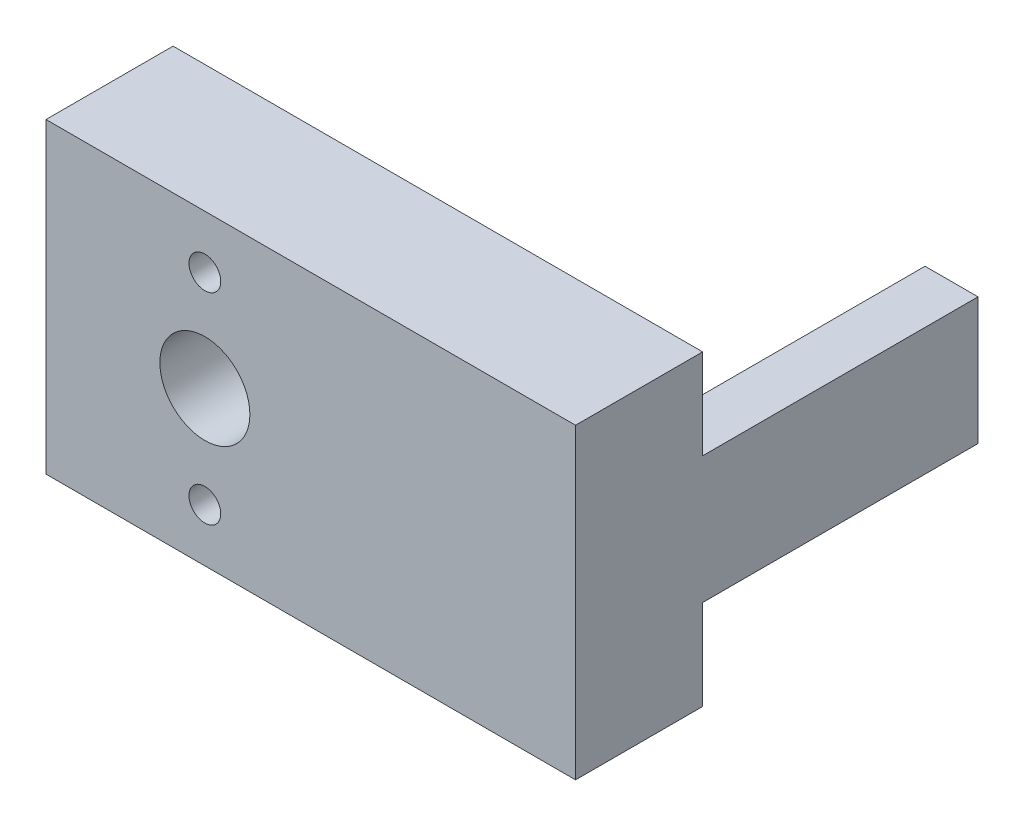
ISO-10303-21;
HEADER;
FILE_DESCRIPTION(('STEP AP214'),'2;1');
FILE_NAME('part.step','',(''),(''),'','','');
FILE_SCHEMA(('AUTOMOTIVE_DESIGN { 1 0 10303 214 1 1 1 1 }'));
ENDSEC;
DATA;
#1=APPLICATION_CONTEXT('core data for automotive mechanical design processes');
#2=APPLICATION_PROTOCOL_DEFINITION('international standard','automotive_design',2000,#1);
#3=PRODUCT_CONTEXT('',#1,'mechanical');
#4=PRODUCT('Part','Part','',(#3));
#5=PRODUCT_RELATED_PRODUCT_CATEGORY('part','',(#4));
#6=PRODUCT_DEFINITION_FORMATION('','',#4);
#7=PRODUCT_DEFINITION_CONTEXT('part definition',#1,'design');
#8=PRODUCT_DEFINITION('design','',#6,#7);
#9=PRODUCT_DEFINITION_SHAPE('','',#8);
#10=(LENGTH_UNIT() NAMED_UNIT(*) SI_UNIT(.MILLI.,.METRE.));
#11=(NAMED_UNIT(*) PLANE_ANGLE_UNIT() SI_UNIT($,.RADIAN.));
#12=(NAMED_UNIT(*) SI_UNIT($,.STERADIAN.) SOLID_ANGLE_UNIT());
#13=UNCERTAINTY_MEASURE_WITH_UNIT(LENGTH_MEASURE(1.E-05),#10,'distance_accuracy_value','');
#14=(GEOMETRIC_REPRESENTATION_CONTEXT(3) GLOBAL_UNCERTAINTY_ASSIGNED_CONTEXT((#13)) GLOBAL_UNIT_ASSIGNED_CONTEXT((#10,
#11,#12)) REPRESENTATION_CONTEXT('',''));
#15=CARTESIAN_POINT('',(0.,0.,0.));
#16=DIRECTION('',(0.,0.,1.));
#17=DIRECTION('',(1.,0.,0.));
#18=AXIS2_PLACEMENT_3D('',#15,#16,#17);
#19=CARTESIAN_POINT('',(0.,0.,0.));
#20=DIRECTION('',(0.,0.,1.));
#21=DIRECTION('',(1.,0.,0.));
#22=AXIS2_PLACEMENT_3D('',#19,#20,#21);
#23=PLANE('',#22);
#24=CARTESIAN_POINT('',(-12.5,0.,0.));
#25=DIRECTION('',(0.,0.,1.));
#26=DIRECTION('',(1.,0.,0.));
#27=AXIS2_PLACEMENT_3D('',#24,#25,#26);
#28=CIRCLE('',#27,4.25);
#29=CARTESIAN_POINT('',(-8.25,0.,0.));
#30=VERTEX_POINT('',#29);
#31=EDGE_CURVE('E154',#30,#30,#28,.T.);
#32=ORIENTED_EDGE('',*,*,#31,.T.);
#33=EDGE_LOOP('',(#32));
#34=FACE_BOUND('',#33,.T.);
#35=CARTESIAN_POINT('',(-12.5,-9.5,0.));
#36=DIRECTION('',(0.,0.,1.));
#37=DIRECTION('',(1.,0.,0.));
#38=AXIS2_PLACEMENT_3D('',#35,#36,#37);
#39=CIRCLE('',#38,1.5);
#40=CARTESIAN_POINT('',(-11.,-9.5,0.));
#41=VERTEX_POINT('',#40);
#42=EDGE_CURVE('E136',#41,#41,#39,.T.);
#43=ORIENTED_EDGE('',*,*,#42,.T.);
#44=EDGE_LOOP('',(#43));
#45=FACE_BOUND('',#44,.T.);
#46=CARTESIAN_POINT('',(-12.5,9.5,0.));
#47=DIRECTION('',(0.,0.,1.));
#48=DIRECTION('',(1.,0.,0.));
#49=AXIS2_PLACEMENT_3D('',#46,#47,#48);
#50=CIRCLE('',#49,1.5);
#51=CARTESIAN_POINT('',(-11.,9.5,0.));
#52=VERTEX_POINT('',#51);
#53=EDGE_CURVE('E142',#52,#52,#50,.T.);
#54=ORIENTED_EDGE('',*,*,#53,.T.);
#55=EDGE_LOOP('',(#54));
#56=FACE_BOUND('',#55,.T.);
#57=DIRECTION('',(1.,0.,0.));
#58=VECTOR('',#57,1.);
#59=CARTESIAN_POINT('',(22.5,6.,0.));
#60=LINE('',#59,#58);
#61=CARTESIAN_POINT('',(17.5,6.,0.));
#62=VERTEX_POINT('',#61);
#63=CARTESIAN_POINT('',(22.5,6.,0.));
#64=VERTEX_POINT('',#63);
#65=EDGE_CURVE('E55',#62,#64,#60,.T.);
#66=ORIENTED_EDGE('',*,*,#65,.F.);
#67=DIRECTION('',(0.,1.,0.));
#68=VECTOR('',#67,1.);
#69=CARTESIAN_POINT('',(17.5,6.,0.));
#70=LINE('',#69,#68);
#71=CARTESIAN_POINT('',(17.5,-6.,0.));
#72=VERTEX_POINT('',#71);
#73=EDGE_CURVE('E340',#72,#62,#70,.T.);
#74=ORIENTED_EDGE('',*,*,#73,.F.);
#75=DIRECTION('',(-1.,0.,0.));
#76=VECTOR('',#75,1.);
#77=CARTESIAN_POINT('',(17.5,-6.,0.));
#78=LINE('',#77,#76);
#79=CARTESIAN_POINT('',(22.5,-6.,0.));
#80=VERTEX_POINT('',#79);
#81=EDGE_CURVE('E350',#80,#72,#78,.T.);
#82=ORIENTED_EDGE('',*,*,#81,.F.);
#83=DIRECTION('',(0.,1.,0.));
#84=VECTOR('',#83,1.);
#85=CARTESIAN_POINT('',(22.5,14.5,0.));
#86=LINE('',#85,#84);
#87=CARTESIAN_POINT('',(22.5,-14.5,0.));
#88=VERTEX_POINT('',#87);
#89=EDGE_CURVE('E129',#88,#80,#86,.T.);
#90=ORIENTED_EDGE('',*,*,#89,.F.);
#91=DIRECTION('',(1.,0.,0.));
#92=VECTOR('',#91,1.);
#93=CARTESIAN_POINT('',(-27.5,-14.5,0.));
#94=LINE('',#93,#92);
#95=CARTESIAN_POINT('',(-27.5,-14.5,0.));
#96=VERTEX_POINT('',#95);
#97=EDGE_CURVE('E166',#96,#88,#94,.T.);
#98=ORIENTED_EDGE('',*,*,#97,.F.);
#99=DIRECTION('',(0.,-1.,0.));
#100=VECTOR('',#99,1.);
#101=CARTESIAN_POINT('',(-27.5,14.5,0.));
#102=LINE('',#101,#100);
#103=CARTESIAN_POINT('',(-27.5,14.5,0.));
#104=VERTEX_POINT('',#103);
#105=EDGE_CURVE('E181',#104,#96,#102,.T.);
#106=ORIENTED_EDGE('',*,*,#105,.F.);
#107=DIRECTION('',(-1.,0.,0.));
#108=VECTOR('',#107,1.);
#109=CARTESIAN_POINT('',(-27.5,14.5,0.));
#110=LINE('',#109,#108);
#111=CARTESIAN_POINT('',(22.5,14.5,0.));
#112=VERTEX_POINT('',#111);
#113=EDGE_CURVE('E178',#112,#104,#110,.T.);
#114=ORIENTED_EDGE('',*,*,#113,.F.);
#115=EDGE_CURVE('E60',#64,#112,#86,.T.);
#116=ORIENTED_EDGE('',*,*,#115,.F.);
#117=EDGE_LOOP('',(#66,#74,#82,#90,#98,#106,#114,#116));
#118=FACE_BOUND('',#117,.T.);
#119=ADVANCED_FACE('F39',(#34,#45,#56,#118),#23,.F.);
#120=CARTESIAN_POINT('',(22.5,14.5,12.));
#121=DIRECTION('',(-1.,0.,0.));
#122=DIRECTION('',(0.,-1.,0.));
#123=AXIS2_PLACEMENT_3D('',#120,#121,#122);
#124=PLANE('',#123);
#125=ORIENTED_EDGE('',*,*,#89,.T.);
#126=DIRECTION('',(0.,0.,1.));
#127=VECTOR('',#126,1.);
#128=CARTESIAN_POINT('',(22.5,-6.,-26.));
#129=LINE('',#128,#127);
#130=CARTESIAN_POINT('',(22.5,-6.,-26.));
#131=VERTEX_POINT('',#130);
#132=EDGE_CURVE('E108',#131,#80,#129,.T.);
#133=ORIENTED_EDGE('',*,*,#132,.F.);
#134=DIRECTION('',(0.,-1.,0.));
#135=VECTOR('',#134,1.);
#136=CARTESIAN_POINT('',(22.5,-6.,-26.));
#137=LINE('',#136,#135);
#138=CARTESIAN_POINT('',(22.5,6.,-26.));
#139=VERTEX_POINT('',#138);
#140=EDGE_CURVE('E115',#139,#131,#137,.T.);
#141=ORIENTED_EDGE('',*,*,#140,.F.);
#142=DIRECTION('',(0.,0.,1.));
#143=VECTOR('',#142,1.);
#144=CARTESIAN_POINT('',(22.5,6.,-26.));
#145=LINE('',#144,#143);
#146=EDGE_CURVE('E337',#139,#64,#145,.T.);
#147=ORIENTED_EDGE('',*,*,#146,.T.);
#148=ORIENTED_EDGE('',*,*,#115,.T.);
#149=DIRECTION('',(0.,0.,-1.));
#150=VECTOR('',#149,1.);
#151=CARTESIAN_POINT('',(22.5,14.5,12.));
#152=LINE('',#151,#150);
#153=CARTESIAN_POINT('',(22.5,14.5,12.));
#154=VERTEX_POINT('',#153);
#155=EDGE_CURVE('E11',#154,#112,#152,.T.);
#156=ORIENTED_EDGE('',*,*,#155,.F.);
#157=DIRECTION('',(0.,1.,0.));
#158=VECTOR('',#157,1.);
#159=CARTESIAN_POINT('',(22.5,14.5,12.));
#160=LINE('',#159,#158);
#161=CARTESIAN_POINT('',(22.5,-14.5,12.));
#162=VERTEX_POINT('',#161);
#163=EDGE_CURVE('E161',#162,#154,#160,.T.);
#164=ORIENTED_EDGE('',*,*,#163,.F.);
#165=DIRECTION('',(0.,0.,-1.));
#166=VECTOR('',#165,1.);
#167=CARTESIAN_POINT('',(22.5,-14.5,12.));
#168=LINE('',#167,#166);
#169=EDGE_CURVE('E175',#162,#88,#168,.T.);
#170=ORIENTED_EDGE('',*,*,#169,.T.);
#171=EDGE_LOOP('',(#125,#133,#141,#147,#148,#156,#164,#170));
#172=FACE_BOUND('',#171,.T.);
#173=ADVANCED_FACE('F41',(#172),#124,.F.);
#174=CARTESIAN_POINT('',(-27.5,14.5,12.));
#175=DIRECTION('',(0.,-1.,0.));
#176=DIRECTION('',(0.,0.,-1.));
#177=AXIS2_PLACEMENT_3D('',#174,#175,#176);
#178=PLANE('',#177);
#179=ORIENTED_EDGE('',*,*,#113,.T.);
#180=DIRECTION('',(0.,0.,-1.));
#181=VECTOR('',#180,1.);
#182=CARTESIAN_POINT('',(-27.5,14.5,12.));
#183=LINE('',#182,#181);
#184=CARTESIAN_POINT('',(-27.5,14.5,12.));
#185=VERTEX_POINT('',#184);
#186=EDGE_CURVE('E48',#185,#104,#183,.T.);
#187=ORIENTED_EDGE('',*,*,#186,.F.);
#188=DIRECTION('',(-1.,0.,0.));
#189=VECTOR('',#188,1.);
#190=CARTESIAN_POINT('',(-27.5,14.5,12.));
#191=LINE('',#190,#189);
#192=EDGE_CURVE('E165',#154,#185,#191,.T.);
#193=ORIENTED_EDGE('',*,*,#192,.F.);
#194=ORIENTED_EDGE('',*,*,#155,.T.);
#195=EDGE_LOOP('',(#179,#187,#193,#194));
#196=FACE_BOUND('',#195,.T.);
#197=ADVANCED_FACE('F209',(#196),#178,.F.);
#198=CARTESIAN_POINT('',(-27.5,14.5,12.));
#199=DIRECTION('',(1.,0.,0.));
#200=DIRECTION('',(0.,1.,0.));
#201=AXIS2_PLACEMENT_3D('',#198,#199,#200);
#202=PLANE('',#201);
#203=ORIENTED_EDGE('',*,*,#105,.T.);
#204=DIRECTION('',(0.,0.,-1.));
#205=VECTOR('',#204,1.);
#206=CARTESIAN_POINT('',(-27.5,-14.5,12.));
#207=LINE('',#206,#205);
#208=CARTESIAN_POINT('',(-27.5,-14.5,12.));
#209=VERTEX_POINT('',#208);
#210=EDGE_CURVE('E188',#209,#96,#207,.T.);
#211=ORIENTED_EDGE('',*,*,#210,.F.);
#212=DIRECTION('',(0.,-1.,0.));
#213=VECTOR('',#212,1.);
#214=CARTESIAN_POINT('',(-27.5,14.5,12.));
#215=LINE('',#214,#213);
#216=EDGE_CURVE('E169',#185,#209,#215,.T.);
#217=ORIENTED_EDGE('',*,*,#216,.F.);
#218=ORIENTED_EDGE('',*,*,#186,.T.);
#219=EDGE_LOOP('',(#203,#211,#217,#218));
#220=FACE_BOUND('',#219,.T.);
#221=ADVANCED_FACE('F197',(#220),#202,.F.);
#222=CARTESIAN_POINT('',(-27.5,-14.5,12.));
#223=DIRECTION('',(0.,1.,0.));
#224=DIRECTION('',(0.,0.,1.));
#225=AXIS2_PLACEMENT_3D('',#222,#223,#224);
#226=PLANE('',#225);
#227=ORIENTED_EDGE('',*,*,#97,.T.);
#228=ORIENTED_EDGE('',*,*,#169,.F.);
#229=DIRECTION('',(1.,0.,0.));
#230=VECTOR('',#229,1.);
#231=CARTESIAN_POINT('',(-27.5,-14.5,12.));
#232=LINE('',#231,#230);
#233=EDGE_CURVE('E172',#209,#162,#232,.T.);
#234=ORIENTED_EDGE('',*,*,#233,.F.);
#235=ORIENTED_EDGE('',*,*,#210,.T.);
#236=EDGE_LOOP('',(#227,#228,#234,#235));
#237=FACE_BOUND('',#236,.T.);
#238=ADVANCED_FACE('F203',(#237),#226,.F.);
#239=CARTESIAN_POINT('',(0.,0.,12.));
#240=DIRECTION('',(0.,0.,1.));
#241=DIRECTION('',(1.,0.,0.));
#242=AXIS2_PLACEMENT_3D('',#239,#240,#241);
#243=PLANE('',#242);
#244=CARTESIAN_POINT('',(-12.5,9.5,12.));
#245=DIRECTION('',(0.,0.,1.));
#246=DIRECTION('',(1.,0.,0.));
#247=AXIS2_PLACEMENT_3D('',#244,#245,#246);
#248=CIRCLE('',#247,1.5);
#249=CARTESIAN_POINT('',(-11.,9.5,12.));
#250=VERTEX_POINT('',#249);
#251=EDGE_CURVE('E147',#250,#250,#248,.T.);
#252=ORIENTED_EDGE('',*,*,#251,.F.);
#253=EDGE_LOOP('',(#252));
#254=FACE_BOUND('',#253,.T.);
#255=CARTESIAN_POINT('',(-12.5,-9.5,12.));
#256=DIRECTION('',(0.,0.,1.));
#257=DIRECTION('',(1.,0.,0.));
#258=AXIS2_PLACEMENT_3D('',#255,#256,#257);
#259=CIRCLE('',#258,1.5);
#260=CARTESIAN_POINT('',(-11.,-9.5,12.));
#261=VERTEX_POINT('',#260);
#262=EDGE_CURVE('E131',#261,#261,#259,.T.);
#263=ORIENTED_EDGE('',*,*,#262,.F.);
#264=EDGE_LOOP('',(#263));
#265=FACE_BOUND('',#264,.T.);
#266=CARTESIAN_POINT('',(-12.5,0.,12.));
#267=DIRECTION('',(0.,0.,1.));
#268=DIRECTION('',(1.,0.,0.));
#269=AXIS2_PLACEMENT_3D('',#266,#267,#268);
#270=CIRCLE('',#269,4.25);
#271=CARTESIAN_POINT('',(-8.25,0.,12.));
#272=VERTEX_POINT('',#271);
#273=EDGE_CURVE('E146',#272,#272,#270,.T.);
#274=ORIENTED_EDGE('',*,*,#273,.F.);
#275=EDGE_LOOP('',(#274));
#276=FACE_BOUND('',#275,.T.);
#277=ORIENTED_EDGE('',*,*,#163,.T.);
#278=ORIENTED_EDGE('',*,*,#192,.T.);
#279=ORIENTED_EDGE('',*,*,#216,.T.);
#280=ORIENTED_EDGE('',*,*,#233,.T.);
#281=EDGE_LOOP('',(#277,#278,#279,#280));
#282=FACE_BOUND('',#281,.T.);
#283=ADVANCED_FACE('F208',(#254,#265,#276,#282),#243,.T.);
#284=CARTESIAN_POINT('',(-12.5,0.,0.));
#285=DIRECTION('',(0.,0.,1.));
#286=DIRECTION('',(1.,0.,0.));
#287=AXIS2_PLACEMENT_3D('',#284,#285,#286);
#288=CYLINDRICAL_SURFACE('',#287,4.25);
#289=ORIENTED_EDGE('',*,*,#31,.F.);
#290=EDGE_LOOP('',(#289));
#291=FACE_BOUND('',#290,.T.);
#292=ORIENTED_EDGE('',*,*,#273,.T.);
#293=EDGE_LOOP('',(#292));
#294=FACE_BOUND('',#293,.T.);
#295=ADVANCED_FACE('F229',(#291,#294),#288,.F.);
#296=CARTESIAN_POINT('',(-12.5,-9.5,0.));
#297=DIRECTION('',(0.,0.,1.));
#298=DIRECTION('',(1.,0.,0.));
#299=AXIS2_PLACEMENT_3D('',#296,#297,#298);
#300=CYLINDRICAL_SURFACE('',#299,1.5);
#301=ORIENTED_EDGE('',*,*,#42,.F.);
#302=EDGE_LOOP('',(#301));
#303=FACE_BOUND('',#302,.T.);
#304=ORIENTED_EDGE('',*,*,#262,.T.);
#305=EDGE_LOOP('',(#304));
#306=FACE_BOUND('',#305,.T.);
#307=ADVANCED_FACE('F234',(#303,#306),#300,.F.);
#308=CARTESIAN_POINT('',(-12.5,9.5,0.));
#309=DIRECTION('',(0.,0.,1.));
#310=DIRECTION('',(1.,0.,0.));
#311=AXIS2_PLACEMENT_3D('',#308,#309,#310);
#312=CYLINDRICAL_SURFACE('',#311,1.5);
#313=ORIENTED_EDGE('',*,*,#53,.F.);
#314=EDGE_LOOP('',(#313));
#315=FACE_BOUND('',#314,.T.);
#316=ORIENTED_EDGE('',*,*,#251,.T.);
#317=EDGE_LOOP('',(#316));
#318=FACE_BOUND('',#317,.T.);
#319=ADVANCED_FACE('F244',(#315,#318),#312,.F.);
#320=CARTESIAN_POINT('',(17.5,-6.,-26.));
#321=DIRECTION('',(0.,1.,0.));
#322=DIRECTION('',(0.,0.,1.));
#323=AXIS2_PLACEMENT_3D('',#320,#321,#322);
#324=PLANE('',#323);
#325=ORIENTED_EDGE('',*,*,#81,.T.);
#326=DIRECTION('',(0.,0.,1.));
#327=VECTOR('',#326,1.);
#328=CARTESIAN_POINT('',(17.5,-6.,-26.));
#329=LINE('',#328,#327);
#330=CARTESIAN_POINT('',(17.5,-6.,-26.));
#331=VERTEX_POINT('',#330);
#332=EDGE_CURVE('E110',#331,#72,#329,.T.);
#333=ORIENTED_EDGE('',*,*,#332,.F.);
#334=DIRECTION('',(-1.,0.,0.));
#335=VECTOR('',#334,1.);
#336=CARTESIAN_POINT('',(17.5,-6.,-26.));
#337=LINE('',#336,#335);
#338=EDGE_CURVE('E103',#131,#331,#337,.T.);
#339=ORIENTED_EDGE('',*,*,#338,.F.);
#340=ORIENTED_EDGE('',*,*,#132,.T.);
#341=EDGE_LOOP('',(#325,#333,#339,#340));
#342=FACE_BOUND('',#341,.T.);
#343=ADVANCED_FACE('F106',(#342),#324,.F.);
#344=CARTESIAN_POINT('',(17.5,6.,-26.));
#345=DIRECTION('',(1.,0.,0.));
#346=DIRECTION('',(0.,0.,-1.));
#347=AXIS2_PLACEMENT_3D('',#344,#345,#346);
#348=PLANE('',#347);
#349=ORIENTED_EDGE('',*,*,#73,.T.);
#350=DIRECTION('',(0.,0.,1.));
#351=VECTOR('',#350,1.);
#352=CARTESIAN_POINT('',(17.5,6.,-26.));
#353=LINE('',#352,#351);
#354=CARTESIAN_POINT('',(17.5,6.,-26.));
#355=VERTEX_POINT('',#354);
#356=EDGE_CURVE('E138',#355,#62,#353,.T.);
#357=ORIENTED_EDGE('',*,*,#356,.F.);
#358=DIRECTION('',(0.,1.,0.));
#359=VECTOR('',#358,1.);
#360=CARTESIAN_POINT('',(17.5,6.,-26.));
#361=LINE('',#360,#359);
#362=EDGE_CURVE('E114',#331,#355,#361,.T.);
#363=ORIENTED_EDGE('',*,*,#362,.F.);
#364=ORIENTED_EDGE('',*,*,#332,.T.);
#365=EDGE_LOOP('',(#349,#357,#363,#364));
#366=FACE_BOUND('',#365,.T.);
#367=ADVANCED_FACE('F256',(#366),#348,.F.);
#368=CARTESIAN_POINT('',(22.5,6.,-26.));
#369=DIRECTION('',(0.,-1.,0.));
#370=DIRECTION('',(0.,0.,-1.));
#371=AXIS2_PLACEMENT_3D('',#368,#369,#370);
#372=PLANE('',#371);
#373=ORIENTED_EDGE('',*,*,#65,.T.);
#374=ORIENTED_EDGE('',*,*,#146,.F.);
#375=DIRECTION('',(1.,0.,0.));
#376=VECTOR('',#375,1.);
#377=CARTESIAN_POINT('',(22.5,6.,-26.));
#378=LINE('',#377,#376);
#379=EDGE_CURVE('E120',#355,#139,#378,.T.);
#380=ORIENTED_EDGE('',*,*,#379,.F.);
#381=ORIENTED_EDGE('',*,*,#356,.T.);
#382=EDGE_LOOP('',(#373,#374,#380,#381));
#383=FACE_BOUND('',#382,.T.);
#384=ADVANCED_FACE('F259',(#383),#372,.F.);
#385=CARTESIAN_POINT('',(0.,0.,-26.));
#386=DIRECTION('',(0.,0.,1.));
#387=DIRECTION('',(1.,0.,0.));
#388=AXIS2_PLACEMENT_3D('',#385,#386,#387);
#389=PLANE('',#388);
#390=ORIENTED_EDGE('',*,*,#140,.T.);
#391=ORIENTED_EDGE('',*,*,#338,.T.);
#392=ORIENTED_EDGE('',*,*,#362,.T.);
#393=ORIENTED_EDGE('',*,*,#379,.T.);
#394=EDGE_LOOP('',(#390,#391,#392,#393));
#395=FACE_BOUND('',#394,.T.);
#396=ADVANCED_FACE('F118',(#395),#389,.F.);
#397=CLOSED_SHELL('',(#119,#173,#197,#221,#238,#283,#295,#307,#319,#343,#367,#384,#396));
#398=MANIFOLD_SOLID_BREP('B2',#397);
#399=ADVANCED_BREP_SHAPE_REPRESENTATION('',(#18,#398),#14);
#400=SHAPE_DEFINITION_REPRESENTATION(#9,#399);
ENDSEC;
END-ISO-10303-21;
